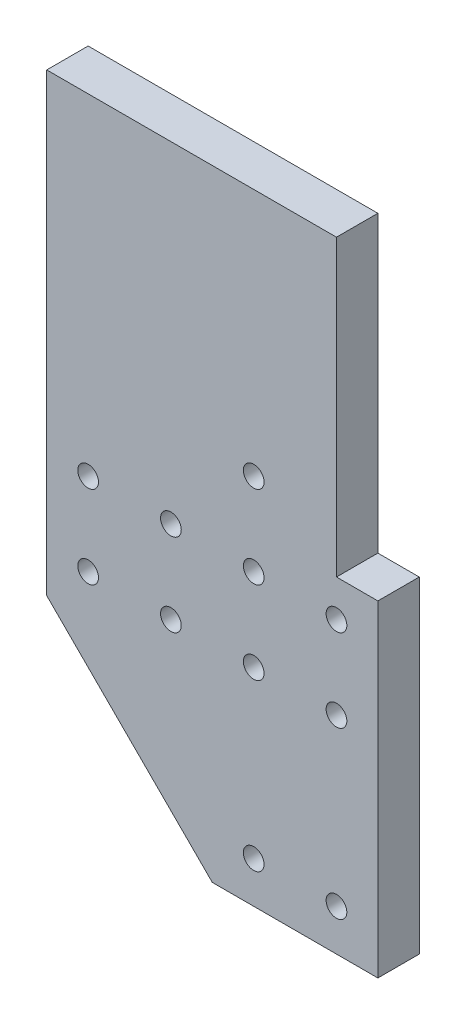
ISO-10303-21;
HEADER;
FILE_DESCRIPTION(('STEP AP214'),'2;1');
FILE_NAME('part.step','',(''),(''),'','','');
FILE_SCHEMA(('AUTOMOTIVE_DESIGN { 1 0 10303 214 1 1 1 1 }'));
ENDSEC;
DATA;
#1=APPLICATION_CONTEXT('core data for automotive mechanical design processes');
#2=APPLICATION_PROTOCOL_DEFINITION('international standard','automotive_design',2000,#1);
#3=PRODUCT_CONTEXT('',#1,'mechanical');
#4=PRODUCT('Part','Part','',(#3));
#5=PRODUCT_RELATED_PRODUCT_CATEGORY('part','',(#4));
#6=PRODUCT_DEFINITION_FORMATION('','',#4);
#7=PRODUCT_DEFINITION_CONTEXT('part definition',#1,'design');
#8=PRODUCT_DEFINITION('design','',#6,#7);
#9=PRODUCT_DEFINITION_SHAPE('','',#8);
#10=(LENGTH_UNIT() NAMED_UNIT(*) SI_UNIT(.MILLI.,.METRE.));
#11=(NAMED_UNIT(*) PLANE_ANGLE_UNIT() SI_UNIT($,.RADIAN.));
#12=(NAMED_UNIT(*) SI_UNIT($,.STERADIAN.) SOLID_ANGLE_UNIT());
#13=UNCERTAINTY_MEASURE_WITH_UNIT(LENGTH_MEASURE(1.E-05),#10,'distance_accuracy_value','');
#14=(GEOMETRIC_REPRESENTATION_CONTEXT(3) GLOBAL_UNCERTAINTY_ASSIGNED_CONTEXT((#13)) GLOBAL_UNIT_ASSIGNED_CONTEXT((#10,
#11,#12)) REPRESENTATION_CONTEXT('',''));
#15=CARTESIAN_POINT('',(0.,0.,0.));
#16=DIRECTION('',(0.,0.,1.));
#17=DIRECTION('',(1.,0.,0.));
#18=AXIS2_PLACEMENT_3D('',#15,#16,#17);
#19=CARTESIAN_POINT('',(-40.,40.,10.));
#20=DIRECTION('',(0.707106781186547,0.707106781186548,0.));
#21=DIRECTION('',(-0.707106781186548,0.707106781186547,0.));
#22=AXIS2_PLACEMENT_3D('',#19,#20,#21);
#23=PLANE('',#22);
#24=DIRECTION('',(0.707106781186548,-0.707106781186547,0.));
#25=VECTOR('',#24,1.);
#26=CARTESIAN_POINT('',(-40.,40.,0.));
#27=LINE('',#26,#25);
#28=CARTESIAN_POINT('',(-40.,40.,0.));
#29=VERTEX_POINT('',#28);
#30=CARTESIAN_POINT('',(0.,0.,0.));
#31=VERTEX_POINT('',#30);
#32=EDGE_CURVE('E139',#29,#31,#27,.T.);
#33=ORIENTED_EDGE('',*,*,#32,.T.);
#34=DIRECTION('',(0.,0.,-1.));
#35=VECTOR('',#34,1.);
#36=CARTESIAN_POINT('',(0.,0.,10.));
#37=LINE('',#36,#35);
#38=CARTESIAN_POINT('',(0.,0.,10.));
#39=VERTEX_POINT('',#38);
#40=EDGE_CURVE('E11',#39,#31,#37,.T.);
#41=ORIENTED_EDGE('',*,*,#40,.F.);
#42=DIRECTION('',(0.707106781186548,-0.707106781186547,0.));
#43=VECTOR('',#42,1.);
#44=CARTESIAN_POINT('',(-40.,40.,10.));
#45=LINE('',#44,#43);
#46=CARTESIAN_POINT('',(-40.,40.,10.));
#47=VERTEX_POINT('',#46);
#48=EDGE_CURVE('E160',#47,#39,#45,.T.);
#49=ORIENTED_EDGE('',*,*,#48,.F.);
#50=DIRECTION('',(0.,0.,-1.));
#51=VECTOR('',#50,1.);
#52=CARTESIAN_POINT('',(-40.,40.,10.));
#53=LINE('',#52,#51);
#54=EDGE_CURVE('E135',#47,#29,#53,.T.);
#55=ORIENTED_EDGE('',*,*,#54,.T.);
#56=EDGE_LOOP('',(#33,#41,#49,#55));
#57=FACE_BOUND('',#56,.T.);
#58=ADVANCED_FACE('F43',(#57),#23,.F.);
#59=CARTESIAN_POINT('',(0.,0.,10.));
#60=DIRECTION('',(0.,1.,0.));
#61=DIRECTION('',(0.,0.,1.));
#62=AXIS2_PLACEMENT_3D('',#59,#60,#61);
#63=PLANE('',#62);
#64=DIRECTION('',(1.,0.,0.));
#65=VECTOR('',#64,1.);
#66=CARTESIAN_POINT('',(0.,0.,0.));
#67=LINE('',#66,#65);
#68=CARTESIAN_POINT('',(40.,0.,0.));
#69=VERTEX_POINT('',#68);
#70=EDGE_CURVE('E143',#31,#69,#67,.T.);
#71=ORIENTED_EDGE('',*,*,#70,.T.);
#72=DIRECTION('',(0.,0.,-1.));
#73=VECTOR('',#72,1.);
#74=CARTESIAN_POINT('',(40.,0.,10.));
#75=LINE('',#74,#73);
#76=CARTESIAN_POINT('',(40.,0.,10.));
#77=VERTEX_POINT('',#76);
#78=EDGE_CURVE('E52',#77,#69,#75,.T.);
#79=ORIENTED_EDGE('',*,*,#78,.F.);
#80=DIRECTION('',(1.,0.,0.));
#81=VECTOR('',#80,1.);
#82=CARTESIAN_POINT('',(0.,0.,10.));
#83=LINE('',#82,#81);
#84=EDGE_CURVE('E98',#39,#77,#83,.T.);
#85=ORIENTED_EDGE('',*,*,#84,.F.);
#86=ORIENTED_EDGE('',*,*,#40,.T.);
#87=EDGE_LOOP('',(#71,#79,#85,#86));
#88=FACE_BOUND('',#87,.T.);
#89=ADVANCED_FACE('F301',(#88),#63,.F.);
#90=CARTESIAN_POINT('',(40.,78.89880614,10.));
#91=DIRECTION('',(-1.,0.,0.));
#92=DIRECTION('',(0.,-1.,0.));
#93=AXIS2_PLACEMENT_3D('',#90,#91,#92);
#94=PLANE('',#93);
#95=DIRECTION('',(0.,1.,0.));
#96=VECTOR('',#95,1.);
#97=CARTESIAN_POINT('',(40.,78.89880614,0.));
#98=LINE('',#97,#96);
#99=CARTESIAN_POINT('',(40.,78.89880614,0.));
#100=VERTEX_POINT('',#99);
#101=EDGE_CURVE('E147',#69,#100,#98,.T.);
#102=ORIENTED_EDGE('',*,*,#101,.T.);
#103=DIRECTION('',(0.,0.,-1.));
#104=VECTOR('',#103,1.);
#105=CARTESIAN_POINT('',(40.,78.89880614,10.));
#106=LINE('',#105,#104);
#107=CARTESIAN_POINT('',(40.,78.89880614,10.));
#108=VERTEX_POINT('',#107);
#109=EDGE_CURVE('E167',#108,#100,#106,.T.);
#110=ORIENTED_EDGE('',*,*,#109,.F.);
#111=DIRECTION('',(0.,1.,0.));
#112=VECTOR('',#111,1.);
#113=CARTESIAN_POINT('',(40.,78.89880614,10.));
#114=LINE('',#113,#112);
#115=EDGE_CURVE('E177',#77,#108,#114,.T.);
#116=ORIENTED_EDGE('',*,*,#115,.F.);
#117=ORIENTED_EDGE('',*,*,#78,.T.);
#118=EDGE_LOOP('',(#102,#110,#116,#117));
#119=FACE_BOUND('',#118,.T.);
#120=ADVANCED_FACE('F175',(#119),#94,.F.);
#121=CARTESIAN_POINT('',(30.,78.89880614,10.));
#122=DIRECTION('',(0.,-1.,0.));
#123=DIRECTION('',(0.,0.,-1.));
#124=AXIS2_PLACEMENT_3D('',#121,#122,#123);
#125=PLANE('',#124);
#126=DIRECTION('',(-1.,0.,0.));
#127=VECTOR('',#126,1.);
#128=CARTESIAN_POINT('',(30.,78.89880614,0.));
#129=LINE('',#128,#127);
#130=CARTESIAN_POINT('',(30.,78.89880614,0.));
#131=VERTEX_POINT('',#130);
#132=EDGE_CURVE('E150',#100,#131,#129,.T.);
#133=ORIENTED_EDGE('',*,*,#132,.T.);
#134=DIRECTION('',(0.,0.,-1.));
#135=VECTOR('',#134,1.);
#136=CARTESIAN_POINT('',(30.,78.89880614,10.));
#137=LINE('',#136,#135);
#138=CARTESIAN_POINT('',(30.,78.89880614,10.));
#139=VERTEX_POINT('',#138);
#140=EDGE_CURVE('E128',#139,#131,#137,.T.);
#141=ORIENTED_EDGE('',*,*,#140,.F.);
#142=DIRECTION('',(-1.,0.,0.));
#143=VECTOR('',#142,1.);
#144=CARTESIAN_POINT('',(30.,78.89880614,10.));
#145=LINE('',#144,#143);
#146=EDGE_CURVE('E115',#108,#139,#145,.T.);
#147=ORIENTED_EDGE('',*,*,#146,.F.);
#148=ORIENTED_EDGE('',*,*,#109,.T.);
#149=EDGE_LOOP('',(#133,#141,#147,#148));
#150=FACE_BOUND('',#149,.T.);
#151=ADVANCED_FACE('F181',(#150),#125,.F.);
#152=CARTESIAN_POINT('',(30.,150.,10.));
#153=DIRECTION('',(-1.,0.,0.));
#154=DIRECTION('',(0.,-1.,0.));
#155=AXIS2_PLACEMENT_3D('',#152,#153,#154);
#156=PLANE('',#155);
#157=DIRECTION('',(0.,1.,0.));
#158=VECTOR('',#157,1.);
#159=CARTESIAN_POINT('',(30.,150.,0.));
#160=LINE('',#159,#158);
#161=CARTESIAN_POINT('',(30.,150.,0.));
#162=VERTEX_POINT('',#161);
#163=EDGE_CURVE('E125',#131,#162,#160,.T.);
#164=ORIENTED_EDGE('',*,*,#163,.T.);
#165=DIRECTION('',(0.,0.,-1.));
#166=VECTOR('',#165,1.);
#167=CARTESIAN_POINT('',(30.,150.,10.));
#168=LINE('',#167,#166);
#169=CARTESIAN_POINT('',(30.,150.,10.));
#170=VERTEX_POINT('',#169);
#171=EDGE_CURVE('E122',#170,#162,#168,.T.);
#172=ORIENTED_EDGE('',*,*,#171,.F.);
#173=DIRECTION('',(0.,1.,0.));
#174=VECTOR('',#173,1.);
#175=CARTESIAN_POINT('',(30.,150.,10.));
#176=LINE('',#175,#174);
#177=EDGE_CURVE('E108',#139,#170,#176,.T.);
#178=ORIENTED_EDGE('',*,*,#177,.F.);
#179=ORIENTED_EDGE('',*,*,#140,.T.);
#180=EDGE_LOOP('',(#164,#172,#178,#179));
#181=FACE_BOUND('',#180,.T.);
#182=ADVANCED_FACE('F123',(#181),#156,.F.);
#183=CARTESIAN_POINT('',(-40.,150.,10.));
#184=DIRECTION('',(0.,-1.,0.));
#185=DIRECTION('',(0.,0.,-1.));
#186=AXIS2_PLACEMENT_3D('',#183,#184,#185);
#187=PLANE('',#186);
#188=DIRECTION('',(-1.,0.,0.));
#189=VECTOR('',#188,1.);
#190=CARTESIAN_POINT('',(-40.,150.,0.));
#191=LINE('',#190,#189);
#192=CARTESIAN_POINT('',(-40.,150.,0.));
#193=VERTEX_POINT('',#192);
#194=EDGE_CURVE('E155',#162,#193,#191,.T.);
#195=ORIENTED_EDGE('',*,*,#194,.T.);
#196=DIRECTION('',(0.,0.,-1.));
#197=VECTOR('',#196,1.);
#198=CARTESIAN_POINT('',(-40.,150.,10.));
#199=LINE('',#198,#197);
#200=CARTESIAN_POINT('',(-40.,150.,10.));
#201=VERTEX_POINT('',#200);
#202=EDGE_CURVE('E129',#201,#193,#199,.T.);
#203=ORIENTED_EDGE('',*,*,#202,.F.);
#204=DIRECTION('',(-1.,0.,0.));
#205=VECTOR('',#204,1.);
#206=CARTESIAN_POINT('',(-40.,150.,10.));
#207=LINE('',#206,#205);
#208=EDGE_CURVE('E112',#170,#201,#207,.T.);
#209=ORIENTED_EDGE('',*,*,#208,.F.);
#210=ORIENTED_EDGE('',*,*,#171,.T.);
#211=EDGE_LOOP('',(#195,#203,#209,#210));
#212=FACE_BOUND('',#211,.T.);
#213=ADVANCED_FACE('F131',(#212),#187,.F.);
#214=CARTESIAN_POINT('',(-40.,80.,10.));
#215=DIRECTION('',(1.,0.,0.));
#216=DIRECTION('',(0.,1.,0.));
#217=AXIS2_PLACEMENT_3D('',#214,#215,#216);
#218=PLANE('',#217);
#219=DIRECTION('',(0.,-1.,0.));
#220=VECTOR('',#219,1.);
#221=CARTESIAN_POINT('',(-40.,80.,0.));
#222=LINE('',#221,#220);
#223=EDGE_CURVE('E86',#193,#29,#222,.T.);
#224=ORIENTED_EDGE('',*,*,#223,.T.);
#225=ORIENTED_EDGE('',*,*,#54,.F.);
#226=DIRECTION('',(0.,-1.,0.));
#227=VECTOR('',#226,1.);
#228=CARTESIAN_POINT('',(-40.,150.,10.));
#229=LINE('',#228,#227);
#230=EDGE_CURVE('E60',#201,#47,#229,.T.);
#231=ORIENTED_EDGE('',*,*,#230,.F.);
#232=ORIENTED_EDGE('',*,*,#202,.T.);
#233=EDGE_LOOP('',(#224,#225,#231,#232));
#234=FACE_BOUND('',#233,.T.);
#235=ADVANCED_FACE('F308',(#234),#218,.F.);
#236=CARTESIAN_POINT('',(0.,0.,10.));
#237=DIRECTION('',(0.,0.,1.));
#238=DIRECTION('',(1.,0.,0.));
#239=AXIS2_PLACEMENT_3D('',#236,#237,#238);
#240=PLANE('',#239);
#241=CARTESIAN_POINT('',(30.,50.,10.));
#242=DIRECTION('',(0.,0.,1.));
#243=DIRECTION('',(1.,0.,0.));
#244=AXIS2_PLACEMENT_3D('',#241,#242,#243);
#245=CIRCLE('',#244,2.5);
#246=CARTESIAN_POINT('',(32.5,50.,10.));
#247=VERTEX_POINT('',#246);
#248=EDGE_CURVE('E223',#247,#247,#245,.T.);
#249=ORIENTED_EDGE('',*,*,#248,.F.);
#250=EDGE_LOOP('',(#249));
#251=FACE_BOUND('',#250,.T.);
#252=CARTESIAN_POINT('',(10.,10.,10.));
#253=DIRECTION('',(0.,0.,1.));
#254=DIRECTION('',(1.,0.,0.));
#255=AXIS2_PLACEMENT_3D('',#252,#253,#254);
#256=CIRCLE('',#255,2.5);
#257=CARTESIAN_POINT('',(12.5,10.,10.));
#258=VERTEX_POINT('',#257);
#259=EDGE_CURVE('E230',#258,#258,#256,.T.);
#260=ORIENTED_EDGE('',*,*,#259,.F.);
#261=EDGE_LOOP('',(#260));
#262=FACE_BOUND('',#261,.T.);
#263=CARTESIAN_POINT('',(30.,10.,10.));
#264=DIRECTION('',(0.,0.,1.));
#265=DIRECTION('',(1.,0.,0.));
#266=AXIS2_PLACEMENT_3D('',#263,#264,#265);
#267=CIRCLE('',#266,2.5);
#268=CARTESIAN_POINT('',(32.5,10.,10.));
#269=VERTEX_POINT('',#268);
#270=EDGE_CURVE('E239',#269,#269,#267,.T.);
#271=ORIENTED_EDGE('',*,*,#270,.F.);
#272=EDGE_LOOP('',(#271));
#273=FACE_BOUND('',#272,.T.);
#274=CARTESIAN_POINT('',(10.,90.,10.));
#275=DIRECTION('',(0.,0.,1.));
#276=DIRECTION('',(1.,0.,0.));
#277=AXIS2_PLACEMENT_3D('',#274,#275,#276);
#278=CIRCLE('',#277,2.5);
#279=CARTESIAN_POINT('',(12.5,90.,10.));
#280=VERTEX_POINT('',#279);
#281=EDGE_CURVE('E246',#280,#280,#278,.T.);
#282=ORIENTED_EDGE('',*,*,#281,.F.);
#283=EDGE_LOOP('',(#282));
#284=FACE_BOUND('',#283,.T.);
#285=CARTESIAN_POINT('',(-10.,70.,10.));
#286=DIRECTION('',(0.,0.,1.));
#287=DIRECTION('',(1.,0.,0.));
#288=AXIS2_PLACEMENT_3D('',#285,#286,#287);
#289=CIRCLE('',#288,2.5);
#290=CARTESIAN_POINT('',(-7.50000000000001,70.,10.));
#291=VERTEX_POINT('',#290);
#292=EDGE_CURVE('E197',#291,#291,#289,.T.);
#293=ORIENTED_EDGE('',*,*,#292,.F.);
#294=EDGE_LOOP('',(#293));
#295=FACE_BOUND('',#294,.T.);
#296=CARTESIAN_POINT('',(-30.,50.,10.));
#297=DIRECTION('',(0.,0.,1.));
#298=DIRECTION('',(1.,0.,0.));
#299=AXIS2_PLACEMENT_3D('',#296,#297,#298);
#300=CIRCLE('',#299,2.5);
#301=CARTESIAN_POINT('',(-27.5,50.,10.));
#302=VERTEX_POINT('',#301);
#303=EDGE_CURVE('E198',#302,#302,#300,.T.);
#304=ORIENTED_EDGE('',*,*,#303,.F.);
#305=EDGE_LOOP('',(#304));
#306=FACE_BOUND('',#305,.T.);
#307=CARTESIAN_POINT('',(-10.,50.,10.));
#308=DIRECTION('',(0.,0.,1.));
#309=DIRECTION('',(1.,0.,0.));
#310=AXIS2_PLACEMENT_3D('',#307,#308,#309);
#311=CIRCLE('',#310,2.5);
#312=CARTESIAN_POINT('',(-7.50000000000001,50.,10.));
#313=VERTEX_POINT('',#312);
#314=EDGE_CURVE('E207',#313,#313,#311,.T.);
#315=ORIENTED_EDGE('',*,*,#314,.F.);
#316=EDGE_LOOP('',(#315));
#317=FACE_BOUND('',#316,.T.);
#318=CARTESIAN_POINT('',(10.,50.,10.));
#319=DIRECTION('',(0.,0.,1.));
#320=DIRECTION('',(1.,0.,0.));
#321=AXIS2_PLACEMENT_3D('',#318,#319,#320);
#322=CIRCLE('',#321,2.5);
#323=CARTESIAN_POINT('',(12.5,50.,10.));
#324=VERTEX_POINT('',#323);
#325=EDGE_CURVE('E214',#324,#324,#322,.T.);
#326=ORIENTED_EDGE('',*,*,#325,.F.);
#327=EDGE_LOOP('',(#326));
#328=FACE_BOUND('',#327,.T.);
#329=CARTESIAN_POINT('',(10.,70.,10.));
#330=DIRECTION('',(0.,0.,1.));
#331=DIRECTION('',(1.,0.,0.));
#332=AXIS2_PLACEMENT_3D('',#329,#330,#331);
#333=CIRCLE('',#332,2.5);
#334=CARTESIAN_POINT('',(12.5,70.,10.));
#335=VERTEX_POINT('',#334);
#336=EDGE_CURVE('E255',#335,#335,#333,.T.);
#337=ORIENTED_EDGE('',*,*,#336,.F.);
#338=EDGE_LOOP('',(#337));
#339=FACE_BOUND('',#338,.T.);
#340=CARTESIAN_POINT('',(30.,70.,10.));
#341=DIRECTION('',(0.,0.,1.));
#342=DIRECTION('',(1.,0.,0.));
#343=AXIS2_PLACEMENT_3D('',#340,#341,#342);
#344=CIRCLE('',#343,2.5);
#345=CARTESIAN_POINT('',(32.5,70.,10.));
#346=VERTEX_POINT('',#345);
#347=EDGE_CURVE('E262',#346,#346,#344,.T.);
#348=ORIENTED_EDGE('',*,*,#347,.F.);
#349=EDGE_LOOP('',(#348));
#350=FACE_BOUND('',#349,.T.);
#351=CARTESIAN_POINT('',(-30.,70.,10.));
#352=DIRECTION('',(0.,0.,1.));
#353=DIRECTION('',(1.,0.,0.));
#354=AXIS2_PLACEMENT_3D('',#351,#352,#353);
#355=CIRCLE('',#354,2.5);
#356=CARTESIAN_POINT('',(-27.5,70.,10.));
#357=VERTEX_POINT('',#356);
#358=EDGE_CURVE('E193',#357,#357,#355,.T.);
#359=ORIENTED_EDGE('',*,*,#358,.F.);
#360=EDGE_LOOP('',(#359));
#361=FACE_BOUND('',#360,.T.);
#362=ORIENTED_EDGE('',*,*,#48,.T.);
#363=ORIENTED_EDGE('',*,*,#84,.T.);
#364=ORIENTED_EDGE('',*,*,#115,.T.);
#365=ORIENTED_EDGE('',*,*,#146,.T.);
#366=ORIENTED_EDGE('',*,*,#177,.T.);
#367=ORIENTED_EDGE('',*,*,#208,.T.);
#368=ORIENTED_EDGE('',*,*,#230,.T.);
#369=EDGE_LOOP('',(#362,#363,#364,#365,#366,#367,#368));
#370=FACE_BOUND('',#369,.T.);
#371=ADVANCED_FACE('F110',(#251,#262,#273,#284,#295,#306,#317,#328,#339,#350,#361,#370),#240,.T.);
#372=CARTESIAN_POINT('',(0.,0.,0.));
#373=DIRECTION('',(0.,0.,1.));
#374=DIRECTION('',(1.,0.,0.));
#375=AXIS2_PLACEMENT_3D('',#372,#373,#374);
#376=PLANE('',#375);
#377=CARTESIAN_POINT('',(30.,50.,0.));
#378=DIRECTION('',(0.,0.,1.));
#379=DIRECTION('',(1.,0.,0.));
#380=AXIS2_PLACEMENT_3D('',#377,#378,#379);
#381=CIRCLE('',#380,2.5);
#382=CARTESIAN_POINT('',(32.5,50.,0.));
#383=VERTEX_POINT('',#382);
#384=EDGE_CURVE('E234',#383,#383,#381,.F.);
#385=ORIENTED_EDGE('',*,*,#384,.F.);
#386=EDGE_LOOP('',(#385));
#387=FACE_BOUND('',#386,.T.);
#388=CARTESIAN_POINT('',(10.,10.,0.));
#389=DIRECTION('',(0.,0.,1.));
#390=DIRECTION('',(1.,0.,0.));
#391=AXIS2_PLACEMENT_3D('',#388,#389,#390);
#392=CIRCLE('',#391,2.5);
#393=CARTESIAN_POINT('',(12.5,10.,0.));
#394=VERTEX_POINT('',#393);
#395=EDGE_CURVE('E235',#394,#394,#392,.F.);
#396=ORIENTED_EDGE('',*,*,#395,.F.);
#397=EDGE_LOOP('',(#396));
#398=FACE_BOUND('',#397,.T.);
#399=CARTESIAN_POINT('',(30.,10.,0.));
#400=DIRECTION('',(0.,0.,1.));
#401=DIRECTION('',(1.,0.,0.));
#402=AXIS2_PLACEMENT_3D('',#399,#400,#401);
#403=CIRCLE('',#402,2.5);
#404=CARTESIAN_POINT('',(32.5,10.,0.));
#405=VERTEX_POINT('',#404);
#406=EDGE_CURVE('E250',#405,#405,#403,.F.);
#407=ORIENTED_EDGE('',*,*,#406,.F.);
#408=EDGE_LOOP('',(#407));
#409=FACE_BOUND('',#408,.T.);
#410=CARTESIAN_POINT('',(10.,90.,0.));
#411=DIRECTION('',(0.,0.,1.));
#412=DIRECTION('',(1.,0.,0.));
#413=AXIS2_PLACEMENT_3D('',#410,#411,#412);
#414=CIRCLE('',#413,2.5);
#415=CARTESIAN_POINT('',(12.5,90.,0.));
#416=VERTEX_POINT('',#415);
#417=EDGE_CURVE('E251',#416,#416,#414,.F.);
#418=ORIENTED_EDGE('',*,*,#417,.F.);
#419=EDGE_LOOP('',(#418));
#420=FACE_BOUND('',#419,.T.);
#421=CARTESIAN_POINT('',(-10.,70.,0.));
#422=DIRECTION('',(0.,0.,1.));
#423=DIRECTION('',(1.,0.,0.));
#424=AXIS2_PLACEMENT_3D('',#421,#422,#423);
#425=CIRCLE('',#424,2.5);
#426=CARTESIAN_POINT('',(-7.50000000000001,70.,0.));
#427=VERTEX_POINT('',#426);
#428=EDGE_CURVE('E202',#427,#427,#425,.F.);
#429=ORIENTED_EDGE('',*,*,#428,.F.);
#430=EDGE_LOOP('',(#429));
#431=FACE_BOUND('',#430,.T.);
#432=CARTESIAN_POINT('',(-30.,50.,0.));
#433=DIRECTION('',(0.,0.,1.));
#434=DIRECTION('',(1.,0.,0.));
#435=AXIS2_PLACEMENT_3D('',#432,#433,#434);
#436=CIRCLE('',#435,2.5);
#437=CARTESIAN_POINT('',(-27.5,50.,0.));
#438=VERTEX_POINT('',#437);
#439=EDGE_CURVE('E203',#438,#438,#436,.F.);
#440=ORIENTED_EDGE('',*,*,#439,.F.);
#441=EDGE_LOOP('',(#440));
#442=FACE_BOUND('',#441,.T.);
#443=CARTESIAN_POINT('',(-10.,50.,0.));
#444=DIRECTION('',(0.,0.,1.));
#445=DIRECTION('',(1.,0.,0.));
#446=AXIS2_PLACEMENT_3D('',#443,#444,#445);
#447=CIRCLE('',#446,2.5);
#448=CARTESIAN_POINT('',(-7.50000000000001,50.,0.));
#449=VERTEX_POINT('',#448);
#450=EDGE_CURVE('E218',#449,#449,#447,.F.);
#451=ORIENTED_EDGE('',*,*,#450,.F.);
#452=EDGE_LOOP('',(#451));
#453=FACE_BOUND('',#452,.T.);
#454=CARTESIAN_POINT('',(10.,50.,0.));
#455=DIRECTION('',(0.,0.,1.));
#456=DIRECTION('',(1.,0.,0.));
#457=AXIS2_PLACEMENT_3D('',#454,#455,#456);
#458=CIRCLE('',#457,2.5);
#459=CARTESIAN_POINT('',(12.5,50.,0.));
#460=VERTEX_POINT('',#459);
#461=EDGE_CURVE('E219',#460,#460,#458,.F.);
#462=ORIENTED_EDGE('',*,*,#461,.F.);
#463=EDGE_LOOP('',(#462));
#464=FACE_BOUND('',#463,.T.);
#465=CARTESIAN_POINT('',(10.,70.,0.));
#466=DIRECTION('',(0.,0.,1.));
#467=DIRECTION('',(1.,0.,0.));
#468=AXIS2_PLACEMENT_3D('',#465,#466,#467);
#469=CIRCLE('',#468,2.5);
#470=CARTESIAN_POINT('',(12.5,70.,0.));
#471=VERTEX_POINT('',#470);
#472=EDGE_CURVE('E266',#471,#471,#469,.F.);
#473=ORIENTED_EDGE('',*,*,#472,.F.);
#474=EDGE_LOOP('',(#473));
#475=FACE_BOUND('',#474,.T.);
#476=CARTESIAN_POINT('',(30.,70.,0.));
#477=DIRECTION('',(0.,0.,1.));
#478=DIRECTION('',(1.,0.,0.));
#479=AXIS2_PLACEMENT_3D('',#476,#477,#478);
#480=CIRCLE('',#479,2.5);
#481=CARTESIAN_POINT('',(32.5,70.,0.));
#482=VERTEX_POINT('',#481);
#483=EDGE_CURVE('E267',#482,#482,#480,.F.);
#484=ORIENTED_EDGE('',*,*,#483,.F.);
#485=EDGE_LOOP('',(#484));
#486=FACE_BOUND('',#485,.T.);
#487=CARTESIAN_POINT('',(-30.,70.,0.));
#488=DIRECTION('',(0.,0.,1.));
#489=DIRECTION('',(1.,0.,0.));
#490=AXIS2_PLACEMENT_3D('',#487,#488,#489);
#491=CIRCLE('',#490,2.5);
#492=CARTESIAN_POINT('',(-27.5,70.,0.));
#493=VERTEX_POINT('',#492);
#494=EDGE_CURVE('E144',#493,#493,#491,.F.);
#495=ORIENTED_EDGE('',*,*,#494,.F.);
#496=EDGE_LOOP('',(#495));
#497=FACE_BOUND('',#496,.T.);
#498=ORIENTED_EDGE('',*,*,#32,.F.);
#499=ORIENTED_EDGE('',*,*,#223,.F.);
#500=ORIENTED_EDGE('',*,*,#194,.F.);
#501=ORIENTED_EDGE('',*,*,#163,.F.);
#502=ORIENTED_EDGE('',*,*,#132,.F.);
#503=ORIENTED_EDGE('',*,*,#101,.F.);
#504=ORIENTED_EDGE('',*,*,#70,.F.);
#505=EDGE_LOOP('',(#498,#499,#500,#501,#502,#503,#504));
#506=FACE_BOUND('',#505,.T.);
#507=ADVANCED_FACE('F179',(#387,#398,#409,#420,#431,#442,#453,#464,#475,#486,#497,#506),#376,.F.);
#508=CARTESIAN_POINT('',(-30.,70.,-0.000999999999999265));
#509=DIRECTION('',(0.,0.,1.));
#510=DIRECTION('',(1.,0.,0.));
#511=AXIS2_PLACEMENT_3D('',#508,#509,#510);
#512=CYLINDRICAL_SURFACE('',#511,2.5);
#513=ORIENTED_EDGE('',*,*,#358,.T.);
#514=EDGE_LOOP('',(#513));
#515=FACE_BOUND('',#514,.T.);
#516=ORIENTED_EDGE('',*,*,#494,.T.);
#517=EDGE_LOOP('',(#516));
#518=FACE_BOUND('',#517,.T.);
#519=ADVANCED_FACE('F282',(#515,#518),#512,.F.);
#520=CARTESIAN_POINT('',(30.,70.,-0.000999999999999265));
#521=DIRECTION('',(0.,0.,1.));
#522=DIRECTION('',(1.,0.,0.));
#523=AXIS2_PLACEMENT_3D('',#520,#521,#522);
#524=CYLINDRICAL_SURFACE('',#523,2.5);
#525=ORIENTED_EDGE('',*,*,#347,.T.);
#526=EDGE_LOOP('',(#525));
#527=FACE_BOUND('',#526,.T.);
#528=ORIENTED_EDGE('',*,*,#483,.T.);
#529=EDGE_LOOP('',(#528));
#530=FACE_BOUND('',#529,.T.);
#531=ADVANCED_FACE('F290',(#527,#530),#524,.F.);
#532=CARTESIAN_POINT('',(10.,70.,-0.000999999999999265));
#533=DIRECTION('',(0.,0.,1.));
#534=DIRECTION('',(1.,0.,0.));
#535=AXIS2_PLACEMENT_3D('',#532,#533,#534);
#536=CYLINDRICAL_SURFACE('',#535,2.5);
#537=ORIENTED_EDGE('',*,*,#336,.T.);
#538=EDGE_LOOP('',(#537));
#539=FACE_BOUND('',#538,.T.);
#540=ORIENTED_EDGE('',*,*,#472,.T.);
#541=EDGE_LOOP('',(#540));
#542=FACE_BOUND('',#541,.T.);
#543=ADVANCED_FACE('F278',(#539,#542),#536,.F.);
#544=CARTESIAN_POINT('',(10.,50.,-0.000999999999999265));
#545=DIRECTION('',(0.,0.,1.));
#546=DIRECTION('',(1.,0.,0.));
#547=AXIS2_PLACEMENT_3D('',#544,#545,#546);
#548=CYLINDRICAL_SURFACE('',#547,2.5);
#549=ORIENTED_EDGE('',*,*,#325,.T.);
#550=EDGE_LOOP('',(#549));
#551=FACE_BOUND('',#550,.T.);
#552=ORIENTED_EDGE('',*,*,#461,.T.);
#553=EDGE_LOOP('',(#552));
#554=FACE_BOUND('',#553,.T.);
#555=ADVANCED_FACE('F380',(#551,#554),#548,.F.);
#556=CARTESIAN_POINT('',(-10.,50.,-0.000999999999999265));
#557=DIRECTION('',(0.,0.,1.));
#558=DIRECTION('',(1.,0.,0.));
#559=AXIS2_PLACEMENT_3D('',#556,#557,#558);
#560=CYLINDRICAL_SURFACE('',#559,2.5);
#561=ORIENTED_EDGE('',*,*,#314,.T.);
#562=EDGE_LOOP('',(#561));
#563=FACE_BOUND('',#562,.T.);
#564=ORIENTED_EDGE('',*,*,#450,.T.);
#565=EDGE_LOOP('',(#564));
#566=FACE_BOUND('',#565,.T.);
#567=ADVANCED_FACE('F391',(#563,#566),#560,.F.);
#568=CARTESIAN_POINT('',(-30.,50.,-0.000999999999999265));
#569=DIRECTION('',(0.,0.,1.));
#570=DIRECTION('',(1.,0.,0.));
#571=AXIS2_PLACEMENT_3D('',#568,#569,#570);
#572=CYLINDRICAL_SURFACE('',#571,2.5);
#573=ORIENTED_EDGE('',*,*,#303,.T.);
#574=EDGE_LOOP('',(#573));
#575=FACE_BOUND('',#574,.T.);
#576=ORIENTED_EDGE('',*,*,#439,.T.);
#577=EDGE_LOOP('',(#576));
#578=FACE_BOUND('',#577,.T.);
#579=ADVANCED_FACE('F402',(#575,#578),#572,.F.);
#580=CARTESIAN_POINT('',(-10.,70.,-0.000999999999999265));
#581=DIRECTION('',(0.,0.,1.));
#582=DIRECTION('',(1.,0.,0.));
#583=AXIS2_PLACEMENT_3D('',#580,#581,#582);
#584=CYLINDRICAL_SURFACE('',#583,2.5);
#585=ORIENTED_EDGE('',*,*,#292,.T.);
#586=EDGE_LOOP('',(#585));
#587=FACE_BOUND('',#586,.T.);
#588=ORIENTED_EDGE('',*,*,#428,.T.);
#589=EDGE_LOOP('',(#588));
#590=FACE_BOUND('',#589,.T.);
#591=ADVANCED_FACE('F413',(#587,#590),#584,.F.);
#592=CARTESIAN_POINT('',(10.,90.,-0.000999999999999265));
#593=DIRECTION('',(0.,0.,1.));
#594=DIRECTION('',(1.,0.,0.));
#595=AXIS2_PLACEMENT_3D('',#592,#593,#594);
#596=CYLINDRICAL_SURFACE('',#595,2.5);
#597=ORIENTED_EDGE('',*,*,#281,.T.);
#598=EDGE_LOOP('',(#597));
#599=FACE_BOUND('',#598,.T.);
#600=ORIENTED_EDGE('',*,*,#417,.T.);
#601=EDGE_LOOP('',(#600));
#602=FACE_BOUND('',#601,.T.);
#603=ADVANCED_FACE('F423',(#599,#602),#596,.F.);
#604=CARTESIAN_POINT('',(30.,10.,-0.000999999999999265));
#605=DIRECTION('',(0.,0.,1.));
#606=DIRECTION('',(1.,0.,0.));
#607=AXIS2_PLACEMENT_3D('',#604,#605,#606);
#608=CYLINDRICAL_SURFACE('',#607,2.5);
#609=ORIENTED_EDGE('',*,*,#270,.T.);
#610=EDGE_LOOP('',(#609));
#611=FACE_BOUND('',#610,.T.);
#612=ORIENTED_EDGE('',*,*,#406,.T.);
#613=EDGE_LOOP('',(#612));
#614=FACE_BOUND('',#613,.T.);
#615=ADVANCED_FACE('F434',(#611,#614),#608,.F.);
#616=CARTESIAN_POINT('',(10.,10.,-0.000999999999999265));
#617=DIRECTION('',(0.,0.,1.));
#618=DIRECTION('',(1.,0.,0.));
#619=AXIS2_PLACEMENT_3D('',#616,#617,#618);
#620=CYLINDRICAL_SURFACE('',#619,2.5);
#621=ORIENTED_EDGE('',*,*,#259,.T.);
#622=EDGE_LOOP('',(#621));
#623=FACE_BOUND('',#622,.T.);
#624=ORIENTED_EDGE('',*,*,#395,.T.);
#625=EDGE_LOOP('',(#624));
#626=FACE_BOUND('',#625,.T.);
#627=ADVANCED_FACE('F445',(#623,#626),#620,.F.);
#628=CARTESIAN_POINT('',(30.,50.,-0.000999999999999265));
#629=DIRECTION('',(0.,0.,1.));
#630=DIRECTION('',(1.,0.,0.));
#631=AXIS2_PLACEMENT_3D('',#628,#629,#630);
#632=CYLINDRICAL_SURFACE('',#631,2.5);
#633=ORIENTED_EDGE('',*,*,#248,.T.);
#634=EDGE_LOOP('',(#633));
#635=FACE_BOUND('',#634,.T.);
#636=ORIENTED_EDGE('',*,*,#384,.T.);
#637=EDGE_LOOP('',(#636));
#638=FACE_BOUND('',#637,.T.);
#639=ADVANCED_FACE('F456',(#635,#638),#632,.F.);
#640=CLOSED_SHELL('',(#58,#89,#120,#151,#182,#213,#235,#371,#507,#519,#531,#543,#555,#567,#579,
#591,#603,#615,#627,#639));
#641=MANIFOLD_SOLID_BREP('B2',#640);
#642=ADVANCED_BREP_SHAPE_REPRESENTATION('',(#18,#641),#14);
#643=SHAPE_DEFINITION_REPRESENTATION(#9,#642);
ENDSEC;
END-ISO-10303-21;
